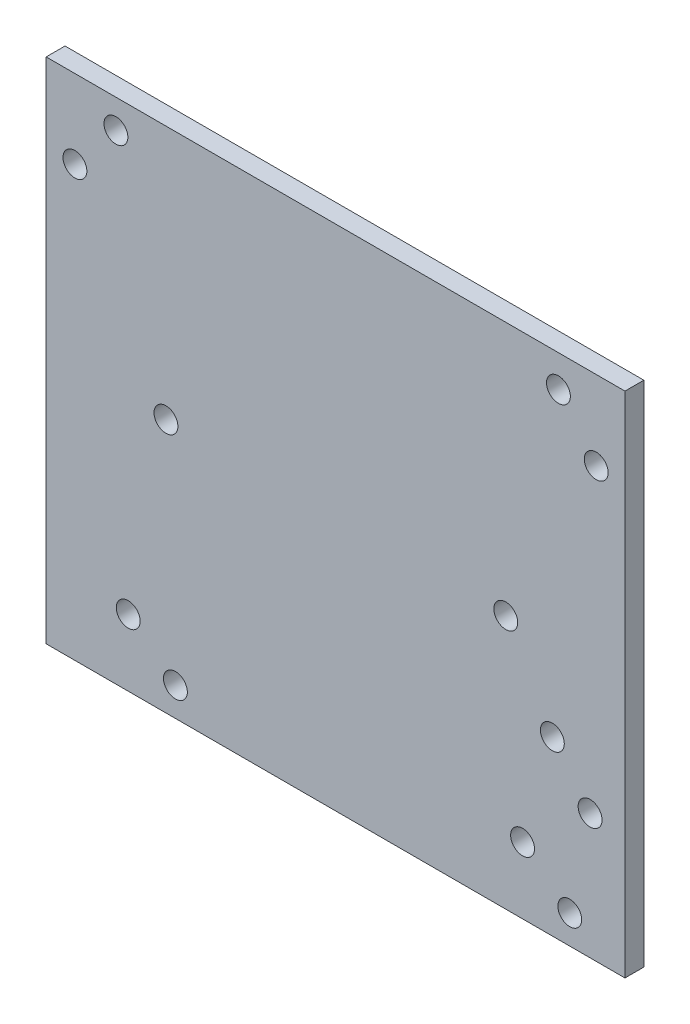
ISO-10303-21;
HEADER;
FILE_DESCRIPTION(('STEP AP214'),'2;1');
FILE_NAME('part.step','',(''),(''),'','','');
FILE_SCHEMA(('AUTOMOTIVE_DESIGN { 1 0 10303 214 1 1 1 1 }'));
ENDSEC;
DATA;
#1=APPLICATION_CONTEXT('core data for automotive mechanical design processes');
#2=APPLICATION_PROTOCOL_DEFINITION('international standard','automotive_design',2000,#1);
#3=PRODUCT_CONTEXT('',#1,'mechanical');
#4=PRODUCT('Part','Part','',(#3));
#5=PRODUCT_RELATED_PRODUCT_CATEGORY('part','',(#4));
#6=PRODUCT_DEFINITION_FORMATION('','',#4);
#7=PRODUCT_DEFINITION_CONTEXT('part definition',#1,'design');
#8=PRODUCT_DEFINITION('design','',#6,#7);
#9=PRODUCT_DEFINITION_SHAPE('','',#8);
#10=(LENGTH_UNIT() NAMED_UNIT(*) SI_UNIT(.MILLI.,.METRE.));
#11=(NAMED_UNIT(*) PLANE_ANGLE_UNIT() SI_UNIT($,.RADIAN.));
#12=(NAMED_UNIT(*) SI_UNIT($,.STERADIAN.) SOLID_ANGLE_UNIT());
#13=UNCERTAINTY_MEASURE_WITH_UNIT(LENGTH_MEASURE(1.E-05),#10,'distance_accuracy_value','');
#14=(GEOMETRIC_REPRESENTATION_CONTEXT(3) GLOBAL_UNCERTAINTY_ASSIGNED_CONTEXT((#13)) GLOBAL_UNIT_ASSIGNED_CONTEXT((#10,
#11,#12)) REPRESENTATION_CONTEXT('',''));
#15=CARTESIAN_POINT('',(0.,0.,0.));
#16=DIRECTION('',(0.,0.,1.));
#17=DIRECTION('',(1.,0.,0.));
#18=AXIS2_PLACEMENT_3D('',#15,#16,#17);
#19=CARTESIAN_POINT('',(0.,0.,-6.35));
#20=DIRECTION('',(0.,0.,1.));
#21=DIRECTION('',(-1.,0.,0.));
#22=AXIS2_PLACEMENT_3D('',#19,#20,#21);
#23=PLANE('',#22);
#24=DIRECTION('',(0.,-1.,0.));
#25=VECTOR('',#24,1.);
#26=CARTESIAN_POINT('',(862.044789876079,217.278265585855,-6.35));
#27=LINE('',#26,#25);
#28=CARTESIAN_POINT('',(862.044789876079,388.233207524856,-6.35));
#29=VERTEX_POINT('',#28);
#30=CARTESIAN_POINT('',(862.044789876079,217.278265585855,-6.35));
#31=VERTEX_POINT('',#30);
#32=EDGE_CURVE('E95',#29,#31,#27,.T.);
#33=ORIENTED_EDGE('',*,*,#32,.F.);
#34=DIRECTION('',(-1.,0.,0.));
#35=VECTOR('',#34,1.);
#36=CARTESIAN_POINT('',(862.044789876079,388.233207524856,-6.35));
#37=LINE('',#36,#35);
#38=CARTESIAN_POINT('',(1056.7178425293,388.233207524856,-6.35));
#39=VERTEX_POINT('',#38);
#40=EDGE_CURVE('E98',#39,#29,#37,.T.);
#41=ORIENTED_EDGE('',*,*,#40,.F.);
#42=DIRECTION('',(0.,1.,0.));
#43=VECTOR('',#42,1.);
#44=CARTESIAN_POINT('',(1056.7178425293,217.278265585855,-6.35));
#45=LINE('',#44,#43);
#46=CARTESIAN_POINT('',(1056.7178425293,217.278265585855,-6.35));
#47=VERTEX_POINT('',#46);
#48=EDGE_CURVE('E86',#47,#39,#45,.T.);
#49=ORIENTED_EDGE('',*,*,#48,.F.);
#50=DIRECTION('',(1.,0.,0.));
#51=VECTOR('',#50,1.);
#52=CARTESIAN_POINT('',(862.044789876079,217.278265585855,-6.35));
#53=LINE('',#52,#51);
#54=EDGE_CURVE('E91',#31,#47,#53,.T.);
#55=ORIENTED_EDGE('',*,*,#54,.F.);
#56=EDGE_LOOP('',(#33,#41,#49,#55));
#57=FACE_BOUND('',#56,.T.);
#58=CARTESIAN_POINT('',(1022.27995941321,239.653265585854,-6.35));
#59=DIRECTION('',(0.,0.,1.));
#60=DIRECTION('',(1.,0.,0.));
#61=AXIS2_PLACEMENT_3D('',#58,#59,#60);
#62=CIRCLE('',#61,4.01269999999996);
#63=CARTESIAN_POINT('',(1026.29265941321,239.653265585854,-6.35));
#64=VERTEX_POINT('',#63);
#65=EDGE_CURVE('E107',#64,#64,#62,.T.);
#66=ORIENTED_EDGE('',*,*,#65,.T.);
#67=EDGE_LOOP('',(#66));
#68=FACE_BOUND('',#67,.T.);
#69=CARTESIAN_POINT('',(1038.15495941321,226.953265585854,-6.35));
#70=DIRECTION('',(0.,0.,1.));
#71=DIRECTION('',(1.,0.,0.));
#72=AXIS2_PLACEMENT_3D('',#69,#70,#71);
#73=CIRCLE('',#72,4.01269999999996);
#74=CARTESIAN_POINT('',(1042.16765941321,226.953265585854,-6.35));
#75=VERTEX_POINT('',#74);
#76=EDGE_CURVE('E118',#75,#75,#73,.T.);
#77=ORIENTED_EDGE('',*,*,#76,.T.);
#78=EDGE_LOOP('',(#77));
#79=FACE_BOUND('',#78,.T.);
#80=CARTESIAN_POINT('',(889.644786871235,239.653265585855,-6.35));
#81=DIRECTION('',(0.,0.,1.));
#82=DIRECTION('',(1.,0.,0.));
#83=AXIS2_PLACEMENT_3D('',#80,#81,#82);
#84=CIRCLE('',#83,4.01270000000008);
#85=CARTESIAN_POINT('',(893.657486871235,239.653265585855,-6.35));
#86=VERTEX_POINT('',#85);
#87=EDGE_CURVE('E124',#86,#86,#84,.T.);
#88=ORIENTED_EDGE('',*,*,#87,.T.);
#89=EDGE_LOOP('',(#88));
#90=FACE_BOUND('',#89,.T.);
#91=CARTESIAN_POINT('',(1034.3338599261,377.480941448401,-6.35));
#92=DIRECTION('',(0.,0.,1.));
#93=DIRECTION('',(1.,0.,0.));
#94=AXIS2_PLACEMENT_3D('',#91,#92,#93);
#95=CIRCLE('',#94,4.01270000000019);
#96=CARTESIAN_POINT('',(1038.3465599261,377.480941448401,-6.35));
#97=VERTEX_POINT('',#96);
#98=EDGE_CURVE('E130',#97,#97,#95,.T.);
#99=ORIENTED_EDGE('',*,*,#98,.T.);
#100=EDGE_LOOP('',(#99));
#101=FACE_BOUND('',#100,.T.);
#102=CARTESIAN_POINT('',(1047.0428425293,361.613131700632,-6.35));
#103=DIRECTION('',(0.,0.,1.));
#104=DIRECTION('',(1.,0.,0.));
#105=AXIS2_PLACEMENT_3D('',#102,#103,#104);
#106=CIRCLE('',#105,4.01270000000019);
#107=CARTESIAN_POINT('',(1051.0555425293,361.613131700632,-6.35));
#108=VERTEX_POINT('',#107);
#109=EDGE_CURVE('E136',#108,#108,#106,.T.);
#110=ORIENTED_EDGE('',*,*,#109,.T.);
#111=EDGE_LOOP('',(#110));
#112=FACE_BOUND('',#111,.T.);
#113=CARTESIAN_POINT('',(871.719789876079,361.793284425073,-6.35));
#114=DIRECTION('',(0.,0.,1.));
#115=DIRECTION('',(1.,0.,0.));
#116=AXIS2_PLACEMENT_3D('',#113,#114,#115);
#117=CIRCLE('',#116,4.01270000000008);
#118=CARTESIAN_POINT('',(875.732489876079,361.793284425073,-6.35));
#119=VERTEX_POINT('',#118);
#120=EDGE_CURVE('E142',#119,#119,#117,.T.);
#121=ORIENTED_EDGE('',*,*,#120,.T.);
#122=EDGE_LOOP('',(#121));
#123=FACE_BOUND('',#122,.T.);
#124=CARTESIAN_POINT('',(885.505258453761,378.558207524856,-6.35));
#125=DIRECTION('',(0.,0.,1.));
#126=DIRECTION('',(1.,0.,0.));
#127=AXIS2_PLACEMENT_3D('',#124,#125,#126);
#128=CIRCLE('',#127,4.01270000000008);
#129=CARTESIAN_POINT('',(889.517958453761,378.558207524856,-6.35));
#130=VERTEX_POINT('',#129);
#131=EDGE_CURVE('E148',#130,#130,#128,.T.);
#132=ORIENTED_EDGE('',*,*,#131,.T.);
#133=EDGE_LOOP('',(#132));
#134=FACE_BOUND('',#133,.T.);
#135=CARTESIAN_POINT('',(905.519786871235,226.953265585855,-6.35));
#136=DIRECTION('',(0.,0.,1.));
#137=DIRECTION('',(1.,0.,0.));
#138=AXIS2_PLACEMENT_3D('',#135,#136,#137);
#139=CIRCLE('',#138,4.01270000000008);
#140=CARTESIAN_POINT('',(909.532486871235,226.953265585855,-6.35));
#141=VERTEX_POINT('',#140);
#142=EDGE_CURVE('E154',#141,#141,#139,.T.);
#143=ORIENTED_EDGE('',*,*,#142,.T.);
#144=EDGE_LOOP('',(#143));
#145=FACE_BOUND('',#144,.T.);
#146=CARTESIAN_POINT('',(902.338636268682,302.755736555355,-6.35));
#147=DIRECTION('',(0.,0.,1.));
#148=DIRECTION('',(1.,0.,0.));
#149=AXIS2_PLACEMENT_3D('',#146,#147,#148);
#150=CIRCLE('',#149,4.01270000000008);
#151=CARTESIAN_POINT('',(906.351336268682,302.755736555355,-6.35));
#152=VERTEX_POINT('',#151);
#153=EDGE_CURVE('E160',#152,#152,#150,.T.);
#154=ORIENTED_EDGE('',*,*,#153,.T.);
#155=EDGE_LOOP('',(#154));
#156=FACE_BOUND('',#155,.T.);
#157=CARTESIAN_POINT('',(1016.63863626868,302.755736555355,-6.35));
#158=DIRECTION('',(0.,0.,1.));
#159=DIRECTION('',(-1.,0.,0.));
#160=AXIS2_PLACEMENT_3D('',#157,#158,#159);
#161=CIRCLE('',#160,4.01270000000019);
#162=CARTESIAN_POINT('',(1012.62593626868,302.755736555355,-6.35));
#163=VERTEX_POINT('',#162);
#164=EDGE_CURVE('E166',#163,#163,#161,.T.);
#165=ORIENTED_EDGE('',*,*,#164,.T.);
#166=EDGE_LOOP('',(#165));
#167=FACE_BOUND('',#166,.T.);
#168=CARTESIAN_POINT('',(1032.28657507433,275.289465585855,-6.35));
#169=DIRECTION('',(0.,0.,1.));
#170=DIRECTION('',(1.,0.,0.));
#171=AXIS2_PLACEMENT_3D('',#168,#169,#170);
#172=CIRCLE('',#171,4.02539999999994);
#173=CARTESIAN_POINT('',(1036.31197507433,275.289465585855,-6.35));
#174=VERTEX_POINT('',#173);
#175=EDGE_CURVE('E172',#174,#174,#172,.T.);
#176=ORIENTED_EDGE('',*,*,#175,.T.);
#177=EDGE_LOOP('',(#176));
#178=FACE_BOUND('',#177,.T.);
#179=CARTESIAN_POINT('',(1044.98657507433,259.414465585855,-6.35));
#180=DIRECTION('',(0.,0.,1.));
#181=DIRECTION('',(1.,0.,0.));
#182=AXIS2_PLACEMENT_3D('',#179,#180,#181);
#183=CIRCLE('',#182,4.02539999999994);
#184=CARTESIAN_POINT('',(1049.01197507433,259.414465585855,-6.35));
#185=VERTEX_POINT('',#184);
#186=EDGE_CURVE('E178',#185,#185,#183,.T.);
#187=ORIENTED_EDGE('',*,*,#186,.T.);
#188=EDGE_LOOP('',(#187));
#189=FACE_BOUND('',#188,.T.);
#190=ADVANCED_FACE('F39',(#57,#68,#79,#90,#101,#112,#123,#134,#145,#156,#167,#178,#189),#23,.F.);
#191=CARTESIAN_POINT('',(0.,0.,0.));
#192=DIRECTION('',(0.,0.,1.));
#193=DIRECTION('',(-1.,0.,0.));
#194=AXIS2_PLACEMENT_3D('',#191,#192,#193);
#195=PLANE('',#194);
#196=CARTESIAN_POINT('',(1032.28657507433,275.289465585855,0.));
#197=DIRECTION('',(0.,0.,1.));
#198=DIRECTION('',(1.,0.,0.));
#199=AXIS2_PLACEMENT_3D('',#196,#197,#198);
#200=CIRCLE('',#199,4.02539999999994);
#201=CARTESIAN_POINT('',(1036.31197507433,275.289465585855,0.));
#202=VERTEX_POINT('',#201);
#203=EDGE_CURVE('E175',#202,#202,#200,.T.);
#204=ORIENTED_EDGE('',*,*,#203,.F.);
#205=EDGE_LOOP('',(#204));
#206=FACE_BOUND('',#205,.T.);
#207=CARTESIAN_POINT('',(902.338636268682,302.755736555355,0.));
#208=DIRECTION('',(0.,0.,1.));
#209=DIRECTION('',(1.,0.,0.));
#210=AXIS2_PLACEMENT_3D('',#207,#208,#209);
#211=CIRCLE('',#210,4.01270000000008);
#212=CARTESIAN_POINT('',(906.351336268682,302.755736555355,0.));
#213=VERTEX_POINT('',#212);
#214=EDGE_CURVE('E163',#213,#213,#211,.T.);
#215=ORIENTED_EDGE('',*,*,#214,.F.);
#216=EDGE_LOOP('',(#215));
#217=FACE_BOUND('',#216,.T.);
#218=CARTESIAN_POINT('',(885.505258453761,378.558207524856,0.));
#219=DIRECTION('',(0.,0.,1.));
#220=DIRECTION('',(1.,0.,0.));
#221=AXIS2_PLACEMENT_3D('',#218,#219,#220);
#222=CIRCLE('',#221,4.01270000000008);
#223=CARTESIAN_POINT('',(889.517958453761,378.558207524856,0.));
#224=VERTEX_POINT('',#223);
#225=EDGE_CURVE('E151',#224,#224,#222,.T.);
#226=ORIENTED_EDGE('',*,*,#225,.F.);
#227=EDGE_LOOP('',(#226));
#228=FACE_BOUND('',#227,.T.);
#229=CARTESIAN_POINT('',(1047.0428425293,361.613131700632,0.));
#230=DIRECTION('',(0.,0.,1.));
#231=DIRECTION('',(1.,0.,0.));
#232=AXIS2_PLACEMENT_3D('',#229,#230,#231);
#233=CIRCLE('',#232,4.01270000000019);
#234=CARTESIAN_POINT('',(1051.0555425293,361.613131700632,0.));
#235=VERTEX_POINT('',#234);
#236=EDGE_CURVE('E139',#235,#235,#233,.T.);
#237=ORIENTED_EDGE('',*,*,#236,.F.);
#238=EDGE_LOOP('',(#237));
#239=FACE_BOUND('',#238,.T.);
#240=CARTESIAN_POINT('',(889.644786871235,239.653265585855,0.));
#241=DIRECTION('',(0.,0.,1.));
#242=DIRECTION('',(1.,0.,0.));
#243=AXIS2_PLACEMENT_3D('',#240,#241,#242);
#244=CIRCLE('',#243,4.01270000000008);
#245=CARTESIAN_POINT('',(893.657486871235,239.653265585855,0.));
#246=VERTEX_POINT('',#245);
#247=EDGE_CURVE('E127',#246,#246,#244,.T.);
#248=ORIENTED_EDGE('',*,*,#247,.F.);
#249=EDGE_LOOP('',(#248));
#250=FACE_BOUND('',#249,.T.);
#251=CARTESIAN_POINT('',(1022.27995941321,239.653265585854,0.));
#252=DIRECTION('',(0.,0.,1.));
#253=DIRECTION('',(1.,0.,0.));
#254=AXIS2_PLACEMENT_3D('',#251,#252,#253);
#255=CIRCLE('',#254,4.01269999999996);
#256=CARTESIAN_POINT('',(1026.29265941321,239.653265585854,0.));
#257=VERTEX_POINT('',#256);
#258=EDGE_CURVE('E115',#257,#257,#255,.T.);
#259=ORIENTED_EDGE('',*,*,#258,.F.);
#260=EDGE_LOOP('',(#259));
#261=FACE_BOUND('',#260,.T.);
#262=DIRECTION('',(0.,-1.,0.));
#263=VECTOR('',#262,1.);
#264=CARTESIAN_POINT('',(862.044789876079,217.278265585855,0.));
#265=LINE('',#264,#263);
#266=CARTESIAN_POINT('',(862.044789876079,388.233207524856,0.));
#267=VERTEX_POINT('',#266);
#268=CARTESIAN_POINT('',(862.044789876079,217.278265585855,0.));
#269=VERTEX_POINT('',#268);
#270=EDGE_CURVE('E103',#267,#269,#265,.T.);
#271=ORIENTED_EDGE('',*,*,#270,.T.);
#272=DIRECTION('',(1.,0.,0.));
#273=VECTOR('',#272,1.);
#274=CARTESIAN_POINT('',(862.044789876079,217.278265585855,0.));
#275=LINE('',#274,#273);
#276=CARTESIAN_POINT('',(1056.7178425293,217.278265585855,0.));
#277=VERTEX_POINT('',#276);
#278=EDGE_CURVE('E106',#269,#277,#275,.T.);
#279=ORIENTED_EDGE('',*,*,#278,.T.);
#280=DIRECTION('',(0.,1.,0.));
#281=VECTOR('',#280,1.);
#282=CARTESIAN_POINT('',(1056.7178425293,217.278265585855,0.));
#283=LINE('',#282,#281);
#284=CARTESIAN_POINT('',(1056.7178425293,388.233207524856,0.));
#285=VERTEX_POINT('',#284);
#286=EDGE_CURVE('E89',#277,#285,#283,.T.);
#287=ORIENTED_EDGE('',*,*,#286,.T.);
#288=DIRECTION('',(-1.,0.,0.));
#289=VECTOR('',#288,1.);
#290=CARTESIAN_POINT('',(862.044789876079,388.233207524856,0.));
#291=LINE('',#290,#289);
#292=EDGE_CURVE('E110',#285,#267,#291,.T.);
#293=ORIENTED_EDGE('',*,*,#292,.T.);
#294=EDGE_LOOP('',(#271,#279,#287,#293));
#295=FACE_BOUND('',#294,.T.);
#296=CARTESIAN_POINT('',(1038.15495941321,226.953265585854,0.));
#297=DIRECTION('',(0.,0.,1.));
#298=DIRECTION('',(1.,0.,0.));
#299=AXIS2_PLACEMENT_3D('',#296,#297,#298);
#300=CIRCLE('',#299,4.01269999999996);
#301=CARTESIAN_POINT('',(1042.16765941321,226.953265585854,0.));
#302=VERTEX_POINT('',#301);
#303=EDGE_CURVE('E121',#302,#302,#300,.T.);
#304=ORIENTED_EDGE('',*,*,#303,.F.);
#305=EDGE_LOOP('',(#304));
#306=FACE_BOUND('',#305,.T.);
#307=CARTESIAN_POINT('',(1034.3338599261,377.480941448401,0.));
#308=DIRECTION('',(0.,0.,1.));
#309=DIRECTION('',(1.,0.,0.));
#310=AXIS2_PLACEMENT_3D('',#307,#308,#309);
#311=CIRCLE('',#310,4.01270000000019);
#312=CARTESIAN_POINT('',(1038.3465599261,377.480941448401,0.));
#313=VERTEX_POINT('',#312);
#314=EDGE_CURVE('E133',#313,#313,#311,.T.);
#315=ORIENTED_EDGE('',*,*,#314,.F.);
#316=EDGE_LOOP('',(#315));
#317=FACE_BOUND('',#316,.T.);
#318=CARTESIAN_POINT('',(871.719789876079,361.793284425073,0.));
#319=DIRECTION('',(0.,0.,1.));
#320=DIRECTION('',(1.,0.,0.));
#321=AXIS2_PLACEMENT_3D('',#318,#319,#320);
#322=CIRCLE('',#321,4.01270000000008);
#323=CARTESIAN_POINT('',(875.732489876079,361.793284425073,0.));
#324=VERTEX_POINT('',#323);
#325=EDGE_CURVE('E145',#324,#324,#322,.T.);
#326=ORIENTED_EDGE('',*,*,#325,.F.);
#327=EDGE_LOOP('',(#326));
#328=FACE_BOUND('',#327,.T.);
#329=CARTESIAN_POINT('',(905.519786871235,226.953265585855,0.));
#330=DIRECTION('',(0.,0.,1.));
#331=DIRECTION('',(1.,0.,0.));
#332=AXIS2_PLACEMENT_3D('',#329,#330,#331);
#333=CIRCLE('',#332,4.01270000000008);
#334=CARTESIAN_POINT('',(909.532486871235,226.953265585855,0.));
#335=VERTEX_POINT('',#334);
#336=EDGE_CURVE('E157',#335,#335,#333,.T.);
#337=ORIENTED_EDGE('',*,*,#336,.F.);
#338=EDGE_LOOP('',(#337));
#339=FACE_BOUND('',#338,.T.);
#340=CARTESIAN_POINT('',(1016.63863626868,302.755736555355,0.));
#341=DIRECTION('',(0.,0.,1.));
#342=DIRECTION('',(-1.,0.,0.));
#343=AXIS2_PLACEMENT_3D('',#340,#341,#342);
#344=CIRCLE('',#343,4.01270000000019);
#345=CARTESIAN_POINT('',(1012.62593626868,302.755736555355,0.));
#346=VERTEX_POINT('',#345);
#347=EDGE_CURVE('E169',#346,#346,#344,.T.);
#348=ORIENTED_EDGE('',*,*,#347,.F.);
#349=EDGE_LOOP('',(#348));
#350=FACE_BOUND('',#349,.T.);
#351=CARTESIAN_POINT('',(1044.98657507433,259.414465585855,0.));
#352=DIRECTION('',(0.,0.,1.));
#353=DIRECTION('',(1.,0.,0.));
#354=AXIS2_PLACEMENT_3D('',#351,#352,#353);
#355=CIRCLE('',#354,4.02539999999994);
#356=CARTESIAN_POINT('',(1049.01197507433,259.414465585855,0.));
#357=VERTEX_POINT('',#356);
#358=EDGE_CURVE('E181',#357,#357,#355,.T.);
#359=ORIENTED_EDGE('',*,*,#358,.F.);
#360=EDGE_LOOP('',(#359));
#361=FACE_BOUND('',#360,.T.);
#362=ADVANCED_FACE('F195',(#206,#217,#228,#239,#250,#261,#295,#306,#317,#328,#339,#350,#361),
#195,.T.);
#363=CARTESIAN_POINT('',(862.044789876079,217.278265585855,-6.35));
#364=DIRECTION('',(1.,0.,0.));
#365=DIRECTION('',(0.,0.,1.));
#366=AXIS2_PLACEMENT_3D('',#363,#364,#365);
#367=PLANE('',#366);
#368=ORIENTED_EDGE('',*,*,#270,.F.);
#369=DIRECTION('',(0.,0.,1.));
#370=VECTOR('',#369,1.);
#371=CARTESIAN_POINT('',(862.044789876079,388.233207524856,-6.35));
#372=LINE('',#371,#370);
#373=EDGE_CURVE('E56',#29,#267,#372,.T.);
#374=ORIENTED_EDGE('',*,*,#373,.F.);
#375=ORIENTED_EDGE('',*,*,#32,.T.);
#376=DIRECTION('',(0.,0.,1.));
#377=VECTOR('',#376,1.);
#378=CARTESIAN_POINT('',(862.044789876079,217.278265585855,-6.35));
#379=LINE('',#378,#377);
#380=EDGE_CURVE('E11',#31,#269,#379,.T.);
#381=ORIENTED_EDGE('',*,*,#380,.T.);
#382=EDGE_LOOP('',(#368,#374,#375,#381));
#383=FACE_BOUND('',#382,.T.);
#384=ADVANCED_FACE('F41',(#383),#367,.F.);
#385=CARTESIAN_POINT('',(862.044789876079,217.278265585855,-6.35));
#386=DIRECTION('',(0.,1.,0.));
#387=DIRECTION('',(0.,0.,-1.));
#388=AXIS2_PLACEMENT_3D('',#385,#386,#387);
#389=PLANE('',#388);
#390=ORIENTED_EDGE('',*,*,#278,.F.);
#391=ORIENTED_EDGE('',*,*,#380,.F.);
#392=ORIENTED_EDGE('',*,*,#54,.T.);
#393=DIRECTION('',(0.,0.,1.));
#394=VECTOR('',#393,1.);
#395=CARTESIAN_POINT('',(1056.7178425293,217.278265585855,-6.35));
#396=LINE('',#395,#394);
#397=EDGE_CURVE('E48',#47,#277,#396,.T.);
#398=ORIENTED_EDGE('',*,*,#397,.T.);
#399=EDGE_LOOP('',(#390,#391,#392,#398));
#400=FACE_BOUND('',#399,.T.);
#401=ADVANCED_FACE('F92',(#400),#389,.F.);
#402=CARTESIAN_POINT('',(1056.7178425293,217.278265585855,-6.35));
#403=DIRECTION('',(-1.,0.,0.));
#404=DIRECTION('',(0.,0.,-1.));
#405=AXIS2_PLACEMENT_3D('',#402,#403,#404);
#406=PLANE('',#405);
#407=ORIENTED_EDGE('',*,*,#286,.F.);
#408=ORIENTED_EDGE('',*,*,#397,.F.);
#409=ORIENTED_EDGE('',*,*,#48,.T.);
#410=DIRECTION('',(0.,0.,1.));
#411=VECTOR('',#410,1.);
#412=CARTESIAN_POINT('',(1056.7178425293,388.233207524856,-6.35));
#413=LINE('',#412,#411);
#414=EDGE_CURVE('E72',#39,#285,#413,.T.);
#415=ORIENTED_EDGE('',*,*,#414,.T.);
#416=EDGE_LOOP('',(#407,#408,#409,#415));
#417=FACE_BOUND('',#416,.T.);
#418=ADVANCED_FACE('F84',(#417),#406,.F.);
#419=CARTESIAN_POINT('',(862.044789876079,388.233207524856,-6.35));
#420=DIRECTION('',(0.,-1.,0.));
#421=DIRECTION('',(0.,0.,1.));
#422=AXIS2_PLACEMENT_3D('',#419,#420,#421);
#423=PLANE('',#422);
#424=ORIENTED_EDGE('',*,*,#292,.F.);
#425=ORIENTED_EDGE('',*,*,#414,.F.);
#426=ORIENTED_EDGE('',*,*,#40,.T.);
#427=ORIENTED_EDGE('',*,*,#373,.T.);
#428=EDGE_LOOP('',(#424,#425,#426,#427));
#429=FACE_BOUND('',#428,.T.);
#430=ADVANCED_FACE('F208',(#429),#423,.F.);
#431=CARTESIAN_POINT('',(1022.27995941321,239.653265585854,-6.35));
#432=DIRECTION('',(0.,0.,1.));
#433=DIRECTION('',(-1.,0.,0.));
#434=AXIS2_PLACEMENT_3D('',#431,#432,#433);
#435=CYLINDRICAL_SURFACE('',#434,4.01269999999996);
#436=ORIENTED_EDGE('',*,*,#65,.F.);
#437=EDGE_LOOP('',(#436));
#438=FACE_BOUND('',#437,.T.);
#439=ORIENTED_EDGE('',*,*,#258,.T.);
#440=EDGE_LOOP('',(#439));
#441=FACE_BOUND('',#440,.T.);
#442=ADVANCED_FACE('F211',(#438,#441),#435,.F.);
#443=CARTESIAN_POINT('',(1038.15495941321,226.953265585854,-6.35));
#444=DIRECTION('',(0.,0.,1.));
#445=DIRECTION('',(-1.,0.,0.));
#446=AXIS2_PLACEMENT_3D('',#443,#444,#445);
#447=CYLINDRICAL_SURFACE('',#446,4.01269999999996);
#448=ORIENTED_EDGE('',*,*,#76,.F.);
#449=EDGE_LOOP('',(#448));
#450=FACE_BOUND('',#449,.T.);
#451=ORIENTED_EDGE('',*,*,#303,.T.);
#452=EDGE_LOOP('',(#451));
#453=FACE_BOUND('',#452,.T.);
#454=ADVANCED_FACE('F232',(#450,#453),#447,.F.);
#455=CARTESIAN_POINT('',(889.644786871235,239.653265585855,-6.35));
#456=DIRECTION('',(0.,0.,1.));
#457=DIRECTION('',(-1.,0.,0.));
#458=AXIS2_PLACEMENT_3D('',#455,#456,#457);
#459=CYLINDRICAL_SURFACE('',#458,4.01270000000008);
#460=ORIENTED_EDGE('',*,*,#87,.F.);
#461=EDGE_LOOP('',(#460));
#462=FACE_BOUND('',#461,.T.);
#463=ORIENTED_EDGE('',*,*,#247,.T.);
#464=EDGE_LOOP('',(#463));
#465=FACE_BOUND('',#464,.T.);
#466=ADVANCED_FACE('F239',(#462,#465),#459,.F.);
#467=CARTESIAN_POINT('',(1034.3338599261,377.480941448401,-6.35));
#468=DIRECTION('',(0.,0.,1.));
#469=DIRECTION('',(-1.,0.,0.));
#470=AXIS2_PLACEMENT_3D('',#467,#468,#469);
#471=CYLINDRICAL_SURFACE('',#470,4.01270000000019);
#472=ORIENTED_EDGE('',*,*,#98,.F.);
#473=EDGE_LOOP('',(#472));
#474=FACE_BOUND('',#473,.T.);
#475=ORIENTED_EDGE('',*,*,#314,.T.);
#476=EDGE_LOOP('',(#475));
#477=FACE_BOUND('',#476,.T.);
#478=ADVANCED_FACE('F247',(#474,#477),#471,.F.);
#479=CARTESIAN_POINT('',(1047.0428425293,361.613131700632,-6.35));
#480=DIRECTION('',(0.,0.,1.));
#481=DIRECTION('',(-1.,0.,0.));
#482=AXIS2_PLACEMENT_3D('',#479,#480,#481);
#483=CYLINDRICAL_SURFACE('',#482,4.01270000000019);
#484=ORIENTED_EDGE('',*,*,#109,.F.);
#485=EDGE_LOOP('',(#484));
#486=FACE_BOUND('',#485,.T.);
#487=ORIENTED_EDGE('',*,*,#236,.T.);
#488=EDGE_LOOP('',(#487));
#489=FACE_BOUND('',#488,.T.);
#490=ADVANCED_FACE('F255',(#486,#489),#483,.F.);
#491=CARTESIAN_POINT('',(871.719789876079,361.793284425073,-6.35));
#492=DIRECTION('',(0.,0.,1.));
#493=DIRECTION('',(-1.,0.,0.));
#494=AXIS2_PLACEMENT_3D('',#491,#492,#493);
#495=CYLINDRICAL_SURFACE('',#494,4.01270000000008);
#496=ORIENTED_EDGE('',*,*,#120,.F.);
#497=EDGE_LOOP('',(#496));
#498=FACE_BOUND('',#497,.T.);
#499=ORIENTED_EDGE('',*,*,#325,.T.);
#500=EDGE_LOOP('',(#499));
#501=FACE_BOUND('',#500,.T.);
#502=ADVANCED_FACE('F263',(#498,#501),#495,.F.);
#503=CARTESIAN_POINT('',(885.505258453761,378.558207524856,-6.35));
#504=DIRECTION('',(0.,0.,1.));
#505=DIRECTION('',(-1.,0.,0.));
#506=AXIS2_PLACEMENT_3D('',#503,#504,#505);
#507=CYLINDRICAL_SURFACE('',#506,4.01270000000008);
#508=ORIENTED_EDGE('',*,*,#131,.F.);
#509=EDGE_LOOP('',(#508));
#510=FACE_BOUND('',#509,.T.);
#511=ORIENTED_EDGE('',*,*,#225,.T.);
#512=EDGE_LOOP('',(#511));
#513=FACE_BOUND('',#512,.T.);
#514=ADVANCED_FACE('F271',(#510,#513),#507,.F.);
#515=CARTESIAN_POINT('',(905.519786871235,226.953265585855,-6.35));
#516=DIRECTION('',(0.,0.,1.));
#517=DIRECTION('',(-1.,0.,0.));
#518=AXIS2_PLACEMENT_3D('',#515,#516,#517);
#519=CYLINDRICAL_SURFACE('',#518,4.01270000000008);
#520=ORIENTED_EDGE('',*,*,#142,.F.);
#521=EDGE_LOOP('',(#520));
#522=FACE_BOUND('',#521,.T.);
#523=ORIENTED_EDGE('',*,*,#336,.T.);
#524=EDGE_LOOP('',(#523));
#525=FACE_BOUND('',#524,.T.);
#526=ADVANCED_FACE('F279',(#522,#525),#519,.F.);
#527=CARTESIAN_POINT('',(902.338636268682,302.755736555355,-6.35));
#528=DIRECTION('',(0.,0.,1.));
#529=DIRECTION('',(-1.,0.,0.));
#530=AXIS2_PLACEMENT_3D('',#527,#528,#529);
#531=CYLINDRICAL_SURFACE('',#530,4.01270000000008);
#532=ORIENTED_EDGE('',*,*,#153,.F.);
#533=EDGE_LOOP('',(#532));
#534=FACE_BOUND('',#533,.T.);
#535=ORIENTED_EDGE('',*,*,#214,.T.);
#536=EDGE_LOOP('',(#535));
#537=FACE_BOUND('',#536,.T.);
#538=ADVANCED_FACE('F287',(#534,#537),#531,.F.);
#539=CARTESIAN_POINT('',(1016.63863626868,302.755736555355,-6.35));
#540=DIRECTION('',(0.,0.,1.));
#541=DIRECTION('',(-1.,0.,0.));
#542=AXIS2_PLACEMENT_3D('',#539,#540,#541);
#543=CYLINDRICAL_SURFACE('',#542,4.01270000000019);
#544=ORIENTED_EDGE('',*,*,#164,.F.);
#545=EDGE_LOOP('',(#544));
#546=FACE_BOUND('',#545,.T.);
#547=ORIENTED_EDGE('',*,*,#347,.T.);
#548=EDGE_LOOP('',(#547));
#549=FACE_BOUND('',#548,.T.);
#550=ADVANCED_FACE('F295',(#546,#549),#543,.F.);
#551=CARTESIAN_POINT('',(1032.28657507433,275.289465585855,-6.35));
#552=DIRECTION('',(0.,0.,1.));
#553=DIRECTION('',(-1.,0.,0.));
#554=AXIS2_PLACEMENT_3D('',#551,#552,#553);
#555=CYLINDRICAL_SURFACE('',#554,4.02539999999994);
#556=ORIENTED_EDGE('',*,*,#175,.F.);
#557=EDGE_LOOP('',(#556));
#558=FACE_BOUND('',#557,.T.);
#559=ORIENTED_EDGE('',*,*,#203,.T.);
#560=EDGE_LOOP('',(#559));
#561=FACE_BOUND('',#560,.T.);
#562=ADVANCED_FACE('F191',(#558,#561),#555,.F.);
#563=CARTESIAN_POINT('',(1044.98657507433,259.414465585855,-6.35));
#564=DIRECTION('',(0.,0.,1.));
#565=DIRECTION('',(-1.,0.,0.));
#566=AXIS2_PLACEMENT_3D('',#563,#564,#565);
#567=CYLINDRICAL_SURFACE('',#566,4.02539999999994);
#568=ORIENTED_EDGE('',*,*,#186,.F.);
#569=EDGE_LOOP('',(#568));
#570=FACE_BOUND('',#569,.T.);
#571=ORIENTED_EDGE('',*,*,#358,.T.);
#572=EDGE_LOOP('',(#571));
#573=FACE_BOUND('',#572,.T.);
#574=ADVANCED_FACE('F188',(#570,#573),#567,.F.);
#575=CLOSED_SHELL('',(#190,#362,#384,#401,#418,#430,#442,#454,#466,#478,#490,#502,#514,#526,
#538,#550,#562,#574));
#576=MANIFOLD_SOLID_BREP('B2',#575);
#577=ADVANCED_BREP_SHAPE_REPRESENTATION('',(#18,#576),#14);
#578=SHAPE_DEFINITION_REPRESENTATION(#9,#577);
ENDSEC;
END-ISO-10303-21;
